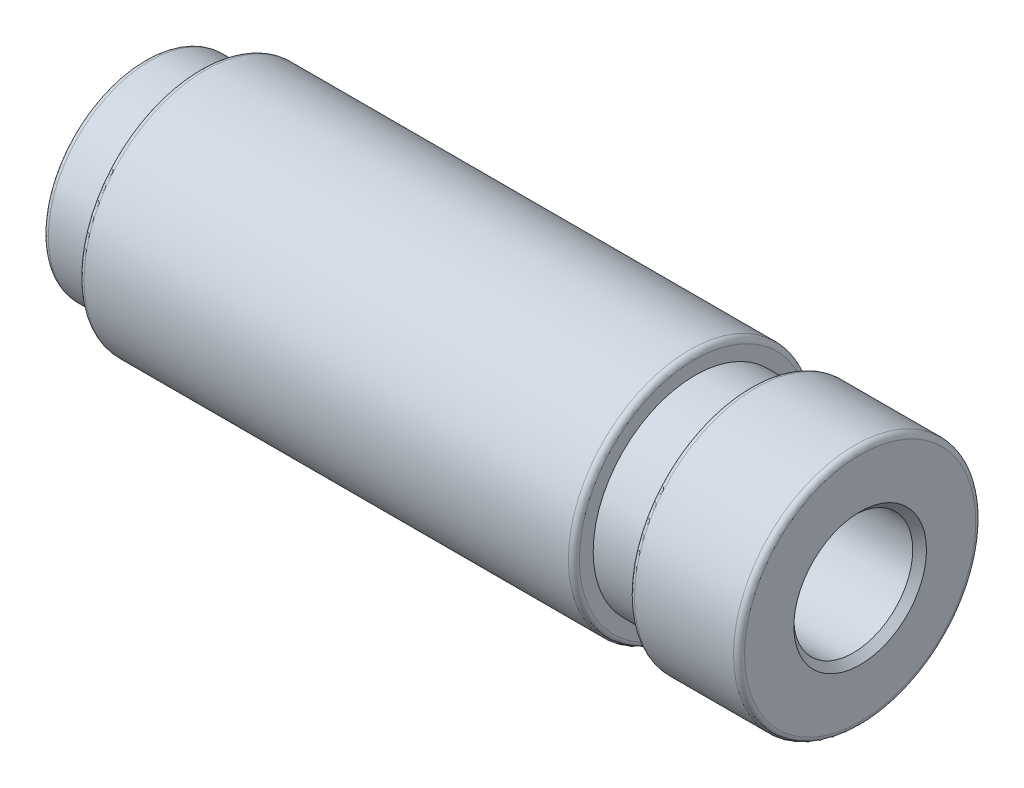
ISO-10303-21;
HEADER;
FILE_DESCRIPTION(('STEP AP214'),'2;1');
FILE_NAME('part.step','',(''),(''),'','','');
FILE_SCHEMA(('AUTOMOTIVE_DESIGN { 1 0 10303 214 1 1 1 1 }'));
ENDSEC;
DATA;
#1=APPLICATION_CONTEXT('core data for automotive mechanical design processes');
#2=APPLICATION_PROTOCOL_DEFINITION('international standard','automotive_design',2000,#1);
#3=PRODUCT_CONTEXT('',#1,'mechanical');
#4=PRODUCT('Part','Part','',(#3));
#5=PRODUCT_RELATED_PRODUCT_CATEGORY('part','',(#4));
#6=PRODUCT_DEFINITION_FORMATION('','',#4);
#7=PRODUCT_DEFINITION_CONTEXT('part definition',#1,'design');
#8=PRODUCT_DEFINITION('design','',#6,#7);
#9=PRODUCT_DEFINITION_SHAPE('','',#8);
#10=(LENGTH_UNIT() NAMED_UNIT(*) SI_UNIT(.MILLI.,.METRE.));
#11=(NAMED_UNIT(*) PLANE_ANGLE_UNIT() SI_UNIT($,.RADIAN.));
#12=(NAMED_UNIT(*) SI_UNIT($,.STERADIAN.) SOLID_ANGLE_UNIT());
#13=UNCERTAINTY_MEASURE_WITH_UNIT(LENGTH_MEASURE(1.E-05),#10,'distance_accuracy_value','');
#14=(GEOMETRIC_REPRESENTATION_CONTEXT(3) GLOBAL_UNCERTAINTY_ASSIGNED_CONTEXT((#13)) GLOBAL_UNIT_ASSIGNED_CONTEXT((#10,
#11,#12)) REPRESENTATION_CONTEXT('',''));
#15=CARTESIAN_POINT('',(0.,0.,0.));
#16=DIRECTION('',(0.,0.,1.));
#17=DIRECTION('',(1.,0.,0.));
#18=AXIS2_PLACEMENT_3D('',#15,#16,#17);
#19=CARTESIAN_POINT('',(0.,9.24999999999999,0.));
#20=DIRECTION('',(1.,0.,0.));
#21=DIRECTION('',(0.,0.,-1.));
#22=AXIS2_PLACEMENT_3D('',#19,#20,#21);
#23=PLANE('',#22);
#24=CARTESIAN_POINT('',(0.,0.,0.));
#25=DIRECTION('',(1.,0.,0.));
#26=DIRECTION('',(0.,0.,-1.));
#27=AXIS2_PLACEMENT_3D('',#24,#25,#26);
#28=CIRCLE('',#27,8.74999999999999);
#29=CARTESIAN_POINT('',(0.,0.,-8.75000000000001));
#30=VERTEX_POINT('',#29);
#31=EDGE_CURVE('E83',#30,#30,#28,.F.);
#32=ORIENTED_EDGE('',*,*,#31,.T.);
#33=EDGE_LOOP('',(#32));
#34=FACE_BOUND('',#33,.T.);
#35=CARTESIAN_POINT('',(0.,0.,0.));
#36=DIRECTION('',(1.,0.,0.));
#37=DIRECTION('',(0.,0.,-1.));
#38=AXIS2_PLACEMENT_3D('',#35,#36,#37);
#39=CIRCLE('',#38,6.3);
#40=CARTESIAN_POINT('',(0.,0.,-6.30000000000002));
#41=VERTEX_POINT('',#40);
#42=EDGE_CURVE('E86',#41,#41,#39,.T.);
#43=ORIENTED_EDGE('',*,*,#42,.T.);
#44=EDGE_LOOP('',(#43));
#45=FACE_BOUND('',#44,.T.);
#46=ADVANCED_FACE('F48',(#34,#45),#23,.F.);
#47=CARTESIAN_POINT('',(65.,0.,0.));
#48=DIRECTION('',(-1.,0.,0.));
#49=DIRECTION('',(0.,0.,1.));
#50=AXIS2_PLACEMENT_3D('',#47,#48,#49);
#51=PLANE('',#50);
#52=CARTESIAN_POINT('',(65.,0.,0.));
#53=DIRECTION('',(-1.,0.,0.));
#54=DIRECTION('',(0.,0.,1.));
#55=AXIS2_PLACEMENT_3D('',#52,#53,#54);
#56=CIRCLE('',#55,10.5);
#57=CARTESIAN_POINT('',(65.,0.,10.5));
#58=VERTEX_POINT('',#57);
#59=EDGE_CURVE('E71',#58,#58,#56,.F.);
#60=ORIENTED_EDGE('',*,*,#59,.T.);
#61=EDGE_LOOP('',(#60));
#62=FACE_BOUND('',#61,.T.);
#63=CARTESIAN_POINT('',(65.,0.,0.));
#64=DIRECTION('',(1.,0.,0.));
#65=DIRECTION('',(0.,0.,-1.));
#66=AXIS2_PLACEMENT_3D('',#63,#64,#65);
#67=CIRCLE('',#66,6.025);
#68=CARTESIAN_POINT('',(65.,0.,-6.02500000000002));
#69=VERTEX_POINT('',#68);
#70=EDGE_CURVE('E110',#69,#69,#67,.T.);
#71=ORIENTED_EDGE('',*,*,#70,.F.);
#72=EDGE_LOOP('',(#71));
#73=FACE_BOUND('',#72,.T.);
#74=ADVANCED_FACE('F116',(#62,#73),#51,.F.);
#75=CARTESIAN_POINT('',(0.,0.,0.));
#76=DIRECTION('',(-1.,0.,0.));
#77=DIRECTION('',(0.,0.,1.));
#78=AXIS2_PLACEMENT_3D('',#75,#76,#77);
#79=CYLINDRICAL_SURFACE('',#78,11.);
#80=CARTESIAN_POINT('',(64.5,0.,0.));
#81=DIRECTION('',(-1.,0.,0.));
#82=DIRECTION('',(0.,0.,1.));
#83=AXIS2_PLACEMENT_3D('',#80,#81,#82);
#84=CIRCLE('',#83,11.);
#85=CARTESIAN_POINT('',(64.5,0.,11.));
#86=VERTEX_POINT('',#85);
#87=EDGE_CURVE('E74',#86,#86,#84,.T.);
#88=ORIENTED_EDGE('',*,*,#87,.T.);
#89=EDGE_LOOP('',(#88));
#90=FACE_BOUND('',#89,.T.);
#91=CARTESIAN_POINT('',(55.5,0.,0.));
#92=DIRECTION('',(1.,0.,0.));
#93=DIRECTION('',(0.,0.,-1.));
#94=AXIS2_PLACEMENT_3D('',#91,#92,#93);
#95=CIRCLE('',#94,11.);
#96=CARTESIAN_POINT('',(55.5,0.,-11.));
#97=VERTEX_POINT('',#96);
#98=EDGE_CURVE('E77',#97,#97,#95,.T.);
#99=ORIENTED_EDGE('',*,*,#98,.T.);
#100=EDGE_LOOP('',(#99));
#101=FACE_BOUND('',#100,.T.);
#102=ADVANCED_FACE('F118',(#90,#101),#79,.T.);
#103=CARTESIAN_POINT('',(55.,11.,0.));
#104=DIRECTION('',(1.,0.,0.));
#105=DIRECTION('',(0.,0.,-1.));
#106=AXIS2_PLACEMENT_3D('',#103,#104,#105);
#107=PLANE('',#106);
#108=CARTESIAN_POINT('',(55.,0.,0.));
#109=DIRECTION('',(1.,0.,0.));
#110=DIRECTION('',(0.,0.,-1.));
#111=AXIS2_PLACEMENT_3D('',#108,#109,#110);
#112=CIRCLE('',#111,10.5);
#113=CARTESIAN_POINT('',(55.,0.,-10.5));
#114=VERTEX_POINT('',#113);
#115=EDGE_CURVE('E68',#114,#114,#112,.F.);
#116=ORIENTED_EDGE('',*,*,#115,.T.);
#117=EDGE_LOOP('',(#116));
#118=FACE_BOUND('',#117,.T.);
#119=CARTESIAN_POINT('',(55.,0.,0.));
#120=DIRECTION('',(-1.,0.,0.));
#121=DIRECTION('',(0.,0.,1.));
#122=AXIS2_PLACEMENT_3D('',#119,#120,#121);
#123=CIRCLE('',#122,9.25);
#124=CARTESIAN_POINT('',(55.,0.,9.25000000000002));
#125=VERTEX_POINT('',#124);
#126=EDGE_CURVE('E92',#125,#125,#123,.T.);
#127=ORIENTED_EDGE('',*,*,#126,.F.);
#128=EDGE_LOOP('',(#127));
#129=FACE_BOUND('',#128,.T.);
#130=ADVANCED_FACE('F125',(#118,#129),#107,.F.);
#131=CARTESIAN_POINT('',(0.,0.,0.));
#132=DIRECTION('',(-1.,0.,0.));
#133=DIRECTION('',(0.,0.,1.));
#134=AXIS2_PLACEMENT_3D('',#131,#132,#133);
#135=CYLINDRICAL_SURFACE('',#134,9.25);
#136=CARTESIAN_POINT('',(50.,0.,0.));
#137=DIRECTION('',(-1.,0.,0.));
#138=DIRECTION('',(0.,0.,1.));
#139=AXIS2_PLACEMENT_3D('',#136,#137,#138);
#140=CIRCLE('',#139,9.25);
#141=CARTESIAN_POINT('',(50.,0.,9.25000000000002));
#142=VERTEX_POINT('',#141);
#143=EDGE_CURVE('E100',#142,#142,#140,.T.);
#144=ORIENTED_EDGE('',*,*,#143,.F.);
#145=EDGE_LOOP('',(#144));
#146=FACE_BOUND('',#145,.T.);
#147=ORIENTED_EDGE('',*,*,#126,.T.);
#148=EDGE_LOOP('',(#147));
#149=FACE_BOUND('',#148,.T.);
#150=ADVANCED_FACE('F169',(#146,#149),#135,.T.);
#151=CARTESIAN_POINT('',(50.,9.25,0.));
#152=DIRECTION('',(-1.,0.,0.));
#153=DIRECTION('',(0.,0.,1.));
#154=AXIS2_PLACEMENT_3D('',#151,#152,#153);
#155=PLANE('',#154);
#156=CARTESIAN_POINT('',(50.,0.,0.));
#157=DIRECTION('',(-1.,0.,0.));
#158=DIRECTION('',(0.,0.,1.));
#159=AXIS2_PLACEMENT_3D('',#156,#157,#158);
#160=CIRCLE('',#159,10.5);
#161=CARTESIAN_POINT('',(50.,0.,10.5));
#162=VERTEX_POINT('',#161);
#163=EDGE_CURVE('E59',#162,#162,#160,.F.);
#164=ORIENTED_EDGE('',*,*,#163,.T.);
#165=EDGE_LOOP('',(#164));
#166=FACE_BOUND('',#165,.T.);
#167=ORIENTED_EDGE('',*,*,#143,.T.);
#168=EDGE_LOOP('',(#167));
#169=FACE_BOUND('',#168,.T.);
#170=ADVANCED_FACE('F161',(#166,#169),#155,.F.);
#171=CARTESIAN_POINT('',(0.,0.,0.));
#172=DIRECTION('',(-1.,0.,0.));
#173=DIRECTION('',(0.,0.,1.));
#174=AXIS2_PLACEMENT_3D('',#171,#172,#173);
#175=CYLINDRICAL_SURFACE('',#174,11.);
#176=CARTESIAN_POINT('',(5.49999999999999,0.,0.));
#177=DIRECTION('',(1.,0.,0.));
#178=DIRECTION('',(0.,0.,-1.));
#179=AXIS2_PLACEMENT_3D('',#176,#177,#178);
#180=CIRCLE('',#179,11.);
#181=CARTESIAN_POINT('',(5.49999999999999,0.,-11.));
#182=VERTEX_POINT('',#181);
#183=EDGE_CURVE('E12',#182,#182,#180,.T.);
#184=ORIENTED_EDGE('',*,*,#183,.T.);
#185=EDGE_LOOP('',(#184));
#186=FACE_BOUND('',#185,.T.);
#187=CARTESIAN_POINT('',(49.5,0.,0.));
#188=DIRECTION('',(-1.,0.,0.));
#189=DIRECTION('',(0.,0.,1.));
#190=AXIS2_PLACEMENT_3D('',#187,#188,#189);
#191=CIRCLE('',#190,11.);
#192=CARTESIAN_POINT('',(49.5,0.,11.));
#193=VERTEX_POINT('',#192);
#194=EDGE_CURVE('E63',#193,#193,#191,.T.);
#195=ORIENTED_EDGE('',*,*,#194,.T.);
#196=EDGE_LOOP('',(#195));
#197=FACE_BOUND('',#196,.T.);
#198=ADVANCED_FACE('F158',(#186,#197),#175,.T.);
#199=CARTESIAN_POINT('',(4.99999999999999,11.,0.));
#200=DIRECTION('',(1.,0.,0.));
#201=DIRECTION('',(0.,0.,-1.));
#202=AXIS2_PLACEMENT_3D('',#199,#200,#201);
#203=PLANE('',#202);
#204=CARTESIAN_POINT('',(4.99999999999999,0.,0.));
#205=DIRECTION('',(1.,0.,0.));
#206=DIRECTION('',(0.,0.,-1.));
#207=AXIS2_PLACEMENT_3D('',#204,#205,#206);
#208=CIRCLE('',#207,10.5);
#209=CARTESIAN_POINT('',(4.99999999999999,0.,-10.5));
#210=VERTEX_POINT('',#209);
#211=EDGE_CURVE('E55',#210,#210,#208,.F.);
#212=ORIENTED_EDGE('',*,*,#211,.T.);
#213=EDGE_LOOP('',(#212));
#214=FACE_BOUND('',#213,.T.);
#215=CARTESIAN_POINT('',(4.99999999999999,0.,0.));
#216=DIRECTION('',(-1.,0.,0.));
#217=DIRECTION('',(0.,0.,1.));
#218=AXIS2_PLACEMENT_3D('',#215,#216,#217);
#219=CIRCLE('',#218,9.24999999999999);
#220=CARTESIAN_POINT('',(4.99999999999999,0.,9.25000000000002));
#221=VERTEX_POINT('',#220);
#222=EDGE_CURVE('E96',#221,#221,#219,.T.);
#223=ORIENTED_EDGE('',*,*,#222,.F.);
#224=EDGE_LOOP('',(#223));
#225=FACE_BOUND('',#224,.T.);
#226=ADVANCED_FACE('F160',(#214,#225),#203,.F.);
#227=CARTESIAN_POINT('',(0.,0.,0.));
#228=DIRECTION('',(-1.,0.,0.));
#229=DIRECTION('',(0.,0.,1.));
#230=AXIS2_PLACEMENT_3D('',#227,#228,#229);
#231=CYLINDRICAL_SURFACE('',#230,9.24999999999999);
#232=CARTESIAN_POINT('',(0.5,0.,0.));
#233=DIRECTION('',(1.,0.,0.));
#234=DIRECTION('',(0.,0.,-1.));
#235=AXIS2_PLACEMENT_3D('',#232,#233,#234);
#236=CIRCLE('',#235,9.24999999999999);
#237=CARTESIAN_POINT('',(0.5,0.,-9.25000000000002));
#238=VERTEX_POINT('',#237);
#239=EDGE_CURVE('E80',#238,#238,#236,.T.);
#240=ORIENTED_EDGE('',*,*,#239,.T.);
#241=EDGE_LOOP('',(#240));
#242=FACE_BOUND('',#241,.T.);
#243=ORIENTED_EDGE('',*,*,#222,.T.);
#244=EDGE_LOOP('',(#243));
#245=FACE_BOUND('',#244,.T.);
#246=ADVANCED_FACE('F167',(#242,#245),#231,.T.);
#247=CARTESIAN_POINT('',(33.,0.,0.));
#248=DIRECTION('',(-1.,0.,0.));
#249=DIRECTION('',(0.,0.,1.));
#250=AXIS2_PLACEMENT_3D('',#247,#248,#249);
#251=CYLINDRICAL_SURFACE('',#250,4.8);
#252=CARTESIAN_POINT('',(1.49999999999999,0.,0.));
#253=DIRECTION('',(1.,0.,0.));
#254=DIRECTION('',(0.,0.,-1.));
#255=AXIS2_PLACEMENT_3D('',#252,#253,#254);
#256=CIRCLE('',#255,4.8);
#257=CARTESIAN_POINT('',(1.49999999999999,0.,-4.80000000000001));
#258=VERTEX_POINT('',#257);
#259=EDGE_CURVE('E89',#258,#258,#256,.F.);
#260=ORIENTED_EDGE('',*,*,#259,.T.);
#261=EDGE_LOOP('',(#260));
#262=FACE_BOUND('',#261,.T.);
#263=CARTESIAN_POINT('',(32.6394836285835,0.,0.));
#264=DIRECTION('',(1.,0.,0.));
#265=DIRECTION('',(0.,0.,-1.));
#266=AXIS2_PLACEMENT_3D('',#263,#264,#265);
#267=CIRCLE('',#266,4.8);
#268=CARTESIAN_POINT('',(32.6394836285835,0.,-4.80000000000001));
#269=VERTEX_POINT('',#268);
#270=EDGE_CURVE('E93',#269,#269,#267,.T.);
#271=ORIENTED_EDGE('',*,*,#270,.T.);
#272=EDGE_LOOP('',(#271));
#273=FACE_BOUND('',#272,.T.);
#274=ADVANCED_FACE('F215',(#262,#273),#251,.F.);
#275=CARTESIAN_POINT('',(33.,0.,0.));
#276=DIRECTION('',(1.,0.,0.));
#277=DIRECTION('',(0.,0.,-1.));
#278=AXIS2_PLACEMENT_3D('',#275,#276,#277);
#279=CONICAL_SURFACE('',#278,5.39999999999999,1.02974425867665);
#280=CARTESIAN_POINT('',(33.,0.,0.));
#281=DIRECTION('',(1.,0.,0.));
#282=DIRECTION('',(0.,0.,-1.));
#283=AXIS2_PLACEMENT_3D('',#280,#281,#282);
#284=CIRCLE('',#283,5.39999999999999);
#285=CARTESIAN_POINT('',(33.,0.,-5.40000000000001));
#286=VERTEX_POINT('',#285);
#287=EDGE_CURVE('E97',#286,#286,#284,.T.);
#288=ORIENTED_EDGE('',*,*,#287,.T.);
#289=EDGE_LOOP('',(#288));
#290=FACE_BOUND('',#289,.T.);
#291=ORIENTED_EDGE('',*,*,#270,.F.);
#292=EDGE_LOOP('',(#291));
#293=FACE_BOUND('',#292,.T.);
#294=ADVANCED_FACE('F224',(#290,#293),#279,.F.);
#295=CARTESIAN_POINT('',(65.,0.,0.));
#296=DIRECTION('',(1.,0.,0.));
#297=DIRECTION('',(0.,0.,-1.));
#298=AXIS2_PLACEMENT_3D('',#295,#296,#297);
#299=CYLINDRICAL_SURFACE('',#298,5.39999999999999);
#300=ORIENTED_EDGE('',*,*,#287,.F.);
#301=EDGE_LOOP('',(#300));
#302=FACE_BOUND('',#301,.T.);
#303=CARTESIAN_POINT('',(64.375,0.,0.));
#304=DIRECTION('',(1.,0.,0.));
#305=DIRECTION('',(0.,0.,-1.));
#306=AXIS2_PLACEMENT_3D('',#303,#304,#305);
#307=CIRCLE('',#306,5.4);
#308=CARTESIAN_POINT('',(64.375,0.,-5.40000000000001));
#309=VERTEX_POINT('',#308);
#310=EDGE_CURVE('E107',#309,#309,#307,.T.);
#311=ORIENTED_EDGE('',*,*,#310,.T.);
#312=EDGE_LOOP('',(#311));
#313=FACE_BOUND('',#312,.T.);
#314=ADVANCED_FACE('F234',(#302,#313),#299,.F.);
#315=CARTESIAN_POINT('',(65.,0.,0.));
#316=DIRECTION('',(1.,0.,0.));
#317=DIRECTION('',(0.,0.,-1.));
#318=AXIS2_PLACEMENT_3D('',#315,#316,#317);
#319=CONICAL_SURFACE('',#318,6.025,0.785398163397463);
#320=ORIENTED_EDGE('',*,*,#310,.F.);
#321=EDGE_LOOP('',(#320));
#322=FACE_BOUND('',#321,.T.);
#323=ORIENTED_EDGE('',*,*,#70,.T.);
#324=EDGE_LOOP('',(#323));
#325=FACE_BOUND('',#324,.T.);
#326=ADVANCED_FACE('F114',(#322,#325),#319,.F.);
#327=CARTESIAN_POINT('',(1.49999999999999,0.,0.));
#328=DIRECTION('',(1.,0.,0.));
#329=DIRECTION('',(0.,0.,-1.));
#330=AXIS2_PLACEMENT_3D('',#327,#328,#329);
#331=TOROIDAL_SURFACE('',#330,6.3,1.5);
#332=ORIENTED_EDGE('',*,*,#42,.F.);
#333=EDGE_LOOP('',(#332));
#334=FACE_BOUND('',#333,.T.);
#335=ORIENTED_EDGE('',*,*,#259,.F.);
#336=EDGE_LOOP('',(#335));
#337=FACE_BOUND('',#336,.T.);
#338=ADVANCED_FACE('F132',(#334,#337),#331,.T.);
#339=CARTESIAN_POINT('',(0.5,0.,0.));
#340=DIRECTION('',(1.,0.,0.));
#341=DIRECTION('',(0.,0.,-1.));
#342=AXIS2_PLACEMENT_3D('',#339,#340,#341);
#343=TOROIDAL_SURFACE('',#342,8.74999999999999,0.5);
#344=ORIENTED_EDGE('',*,*,#239,.F.);
#345=EDGE_LOOP('',(#344));
#346=FACE_BOUND('',#345,.T.);
#347=ORIENTED_EDGE('',*,*,#31,.F.);
#348=EDGE_LOOP('',(#347));
#349=FACE_BOUND('',#348,.T.);
#350=ADVANCED_FACE('F135',(#346,#349),#343,.T.);
#351=CARTESIAN_POINT('',(64.5,0.,0.));
#352=DIRECTION('',(-1.,0.,0.));
#353=DIRECTION('',(0.,0.,1.));
#354=AXIS2_PLACEMENT_3D('',#351,#352,#353);
#355=TOROIDAL_SURFACE('',#354,10.5,0.5);
#356=ORIENTED_EDGE('',*,*,#59,.F.);
#357=EDGE_LOOP('',(#356));
#358=FACE_BOUND('',#357,.T.);
#359=ORIENTED_EDGE('',*,*,#87,.F.);
#360=EDGE_LOOP('',(#359));
#361=FACE_BOUND('',#360,.T.);
#362=ADVANCED_FACE('F139',(#358,#361),#355,.T.);
#363=CARTESIAN_POINT('',(55.5,0.,0.));
#364=DIRECTION('',(1.,0.,0.));
#365=DIRECTION('',(0.,0.,-1.));
#366=AXIS2_PLACEMENT_3D('',#363,#364,#365);
#367=TOROIDAL_SURFACE('',#366,10.5,0.5);
#368=ORIENTED_EDGE('',*,*,#98,.F.);
#369=EDGE_LOOP('',(#368));
#370=FACE_BOUND('',#369,.T.);
#371=ORIENTED_EDGE('',*,*,#115,.F.);
#372=EDGE_LOOP('',(#371));
#373=FACE_BOUND('',#372,.T.);
#374=ADVANCED_FACE('F143',(#370,#373),#367,.T.);
#375=CARTESIAN_POINT('',(49.5,0.,0.));
#376=DIRECTION('',(-1.,0.,0.));
#377=DIRECTION('',(0.,0.,1.));
#378=AXIS2_PLACEMENT_3D('',#375,#376,#377);
#379=TOROIDAL_SURFACE('',#378,10.5,0.5);
#380=ORIENTED_EDGE('',*,*,#163,.F.);
#381=EDGE_LOOP('',(#380));
#382=FACE_BOUND('',#381,.T.);
#383=ORIENTED_EDGE('',*,*,#194,.F.);
#384=EDGE_LOOP('',(#383));
#385=FACE_BOUND('',#384,.T.);
#386=ADVANCED_FACE('F146',(#382,#385),#379,.T.);
#387=CARTESIAN_POINT('',(5.49999999999999,0.,0.));
#388=DIRECTION('',(1.,0.,0.));
#389=DIRECTION('',(0.,0.,-1.));
#390=AXIS2_PLACEMENT_3D('',#387,#388,#389);
#391=TOROIDAL_SURFACE('',#390,10.5,0.5);
#392=ORIENTED_EDGE('',*,*,#183,.F.);
#393=EDGE_LOOP('',(#392));
#394=FACE_BOUND('',#393,.T.);
#395=ORIENTED_EDGE('',*,*,#211,.F.);
#396=EDGE_LOOP('',(#395));
#397=FACE_BOUND('',#396,.T.);
#398=ADVANCED_FACE('F50',(#394,#397),#391,.T.);
#399=CLOSED_SHELL('',(#46,#74,#102,#130,#150,#170,#198,#226,#246,#274,#294,#314,#326,#338,#350,
#362,#374,#386,#398));
#400=MANIFOLD_SOLID_BREP('B2',#399);
#401=ADVANCED_BREP_SHAPE_REPRESENTATION('',(#18,#400),#14);
#402=SHAPE_DEFINITION_REPRESENTATION(#9,#401);
ENDSEC;
END-ISO-10303-21;
